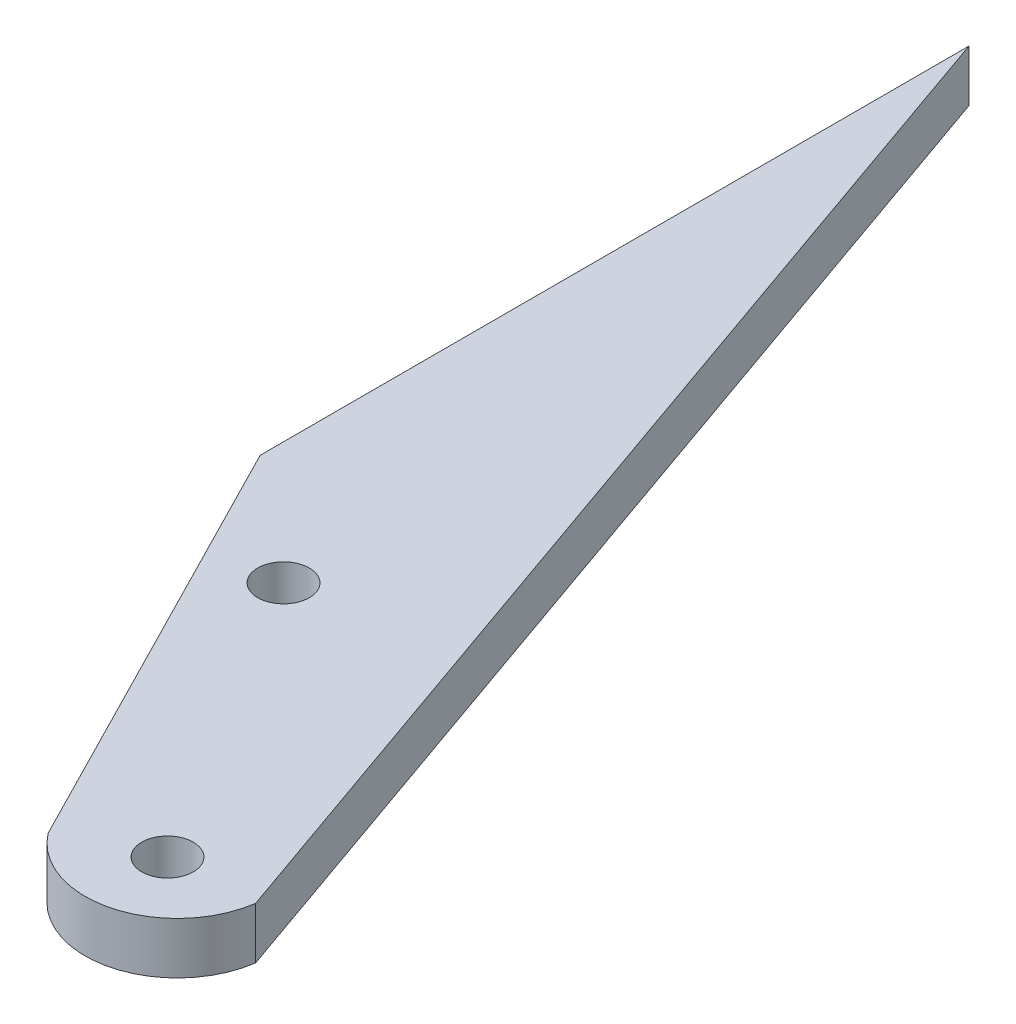
ISO-10303-21;
HEADER;
FILE_DESCRIPTION(('STEP AP214'),'2;1');
FILE_NAME('part.step','',(''),(''),'','','');
FILE_SCHEMA(('AUTOMOTIVE_DESIGN { 1 0 10303 214 1 1 1 1 }'));
ENDSEC;
DATA;
#1=APPLICATION_CONTEXT('core data for automotive mechanical design processes');
#2=APPLICATION_PROTOCOL_DEFINITION('international standard','automotive_design',2000,#1);
#3=PRODUCT_CONTEXT('',#1,'mechanical');
#4=PRODUCT('Part','Part','',(#3));
#5=PRODUCT_RELATED_PRODUCT_CATEGORY('part','',(#4));
#6=PRODUCT_DEFINITION_FORMATION('','',#4);
#7=PRODUCT_DEFINITION_CONTEXT('part definition',#1,'design');
#8=PRODUCT_DEFINITION('design','',#6,#7);
#9=PRODUCT_DEFINITION_SHAPE('','',#8);
#10=(LENGTH_UNIT() NAMED_UNIT(*) SI_UNIT(.MILLI.,.METRE.));
#11=(NAMED_UNIT(*) PLANE_ANGLE_UNIT() SI_UNIT($,.RADIAN.));
#12=(NAMED_UNIT(*) SI_UNIT($,.STERADIAN.) SOLID_ANGLE_UNIT());
#13=UNCERTAINTY_MEASURE_WITH_UNIT(LENGTH_MEASURE(1.E-05),#10,'distance_accuracy_value','');
#14=(GEOMETRIC_REPRESENTATION_CONTEXT(3) GLOBAL_UNCERTAINTY_ASSIGNED_CONTEXT((#13)) GLOBAL_UNIT_ASSIGNED_CONTEXT((#10,
#11,#12)) REPRESENTATION_CONTEXT('',''));
#15=CARTESIAN_POINT('',(0.,0.,0.));
#16=DIRECTION('',(0.,0.,1.));
#17=DIRECTION('',(1.,0.,0.));
#18=AXIS2_PLACEMENT_3D('',#15,#16,#17);
#19=CARTESIAN_POINT('',(-5.30816711174511,3.,-0.748327119110209));
#20=DIRECTION('',(0.,1.,0.));
#21=DIRECTION('',(0.,0.,1.));
#22=AXIS2_PLACEMENT_3D('',#19,#20,#21);
#23=PLANE('',#22);
#24=CARTESIAN_POINT('',(-15.3364804045532,3.,-16.9587094149926));
#25=DIRECTION('',(0.,1.,0.));
#26=DIRECTION('',(0.,0.,1.));
#27=AXIS2_PLACEMENT_3D('',#24,#25,#26);
#28=CIRCLE('',#27,1.5);
#29=CARTESIAN_POINT('',(-15.3364804045532,3.,-15.4587094149926));
#30=VERTEX_POINT('',#29);
#31=EDGE_CURVE('E117',#30,#30,#28,.T.);
#32=ORIENTED_EDGE('',*,*,#31,.F.);
#33=EDGE_LOOP('',(#32));
#34=FACE_BOUND('',#33,.T.);
#35=DIRECTION('',(-0.331173209478894,0.,-0.94356997902829));
#36=VECTOR('',#35,1.);
#37=CARTESIAN_POINT('',(-22.4436084063846,3.,-63.9457374787472));
#38=LINE('',#37,#36);
#39=CARTESIAN_POINT('',(0.,3.,0.));
#40=VERTEX_POINT('',#39);
#41=CARTESIAN_POINT('',(-22.4436084063846,3.,-63.9457374787472));
#42=VERTEX_POINT('',#41);
#43=EDGE_CURVE('E96',#40,#42,#38,.T.);
#44=ORIENTED_EDGE('',*,*,#43,.T.);
#45=DIRECTION('',(0.,0.,1.));
#46=VECTOR('',#45,1.);
#47=CARTESIAN_POINT('',(-22.4436084063846,3.,-63.9457374787472));
#48=LINE('',#47,#46);
#49=CARTESIAN_POINT('',(-22.4436084063846,3.,-22.7057374787472));
#50=VERTEX_POINT('',#49);
#51=EDGE_CURVE('E91',#42,#50,#48,.T.);
#52=ORIENTED_EDGE('',*,*,#51,.T.);
#53=DIRECTION('',(0.454767876649294,0.,0.890610003518876));
#54=VECTOR('',#53,1.);
#55=CARTESIAN_POINT('',(-22.4436084063846,3.,-22.7057374787472));
#56=LINE('',#55,#54);
#57=CARTESIAN_POINT('',(-9.57367749720963,3.,2.49852562083696));
#58=VERTEX_POINT('',#57);
#59=EDGE_CURVE('E94',#50,#58,#56,.T.);
#60=ORIENTED_EDGE('',*,*,#59,.T.);
#61=CARTESIAN_POINT('',(-5.30816711174511,3.,-0.748327119110209));
#62=DIRECTION('',(0.,1.,0.));
#63=DIRECTION('',(0.,0.,1.));
#64=AXIS2_PLACEMENT_3D('',#61,#62,#63);
#65=CIRCLE('',#64,5.36065588929267);
#66=EDGE_CURVE('E61',#58,#40,#65,.T.);
#67=ORIENTED_EDGE('',*,*,#66,.T.);
#68=EDGE_LOOP('',(#44,#52,#60,#67));
#69=FACE_BOUND('',#68,.T.);
#70=CARTESIAN_POINT('',(-4.89794958161071,3.,0.229925616867271));
#71=DIRECTION('',(0.,1.,0.));
#72=DIRECTION('',(0.,0.,1.));
#73=AXIS2_PLACEMENT_3D('',#70,#71,#72);
#74=CIRCLE('',#73,1.5);
#75=CARTESIAN_POINT('',(-4.89794958161071,3.,1.72992561686727));
#76=VERTEX_POINT('',#75);
#77=EDGE_CURVE('E141',#76,#76,#74,.T.);
#78=ORIENTED_EDGE('',*,*,#77,.F.);
#79=EDGE_LOOP('',(#78));
#80=FACE_BOUND('',#79,.T.);
#81=ADVANCED_FACE('F43',(#34,#69,#80),#23,.T.);
#82=CARTESIAN_POINT('',(-5.30816711174511,0.,-0.748327119110209));
#83=DIRECTION('',(0.,1.,0.));
#84=DIRECTION('',(0.,0.,1.));
#85=AXIS2_PLACEMENT_3D('',#82,#83,#84);
#86=PLANE('',#85);
#87=DIRECTION('',(-0.331173209478894,0.,-0.94356997902829));
#88=VECTOR('',#87,1.);
#89=CARTESIAN_POINT('',(-22.4436084063846,0.,-63.9457374787472));
#90=LINE('',#89,#88);
#91=CARTESIAN_POINT('',(0.,0.,0.));
#92=VERTEX_POINT('',#91);
#93=CARTESIAN_POINT('',(-22.4436084063846,0.,-63.9457374787472));
#94=VERTEX_POINT('',#93);
#95=EDGE_CURVE('E113',#92,#94,#90,.T.);
#96=ORIENTED_EDGE('',*,*,#95,.F.);
#97=CARTESIAN_POINT('',(-5.30816711174511,0.,-0.748327119110209));
#98=DIRECTION('',(0.,1.,0.));
#99=DIRECTION('',(0.,0.,1.));
#100=AXIS2_PLACEMENT_3D('',#97,#98,#99);
#101=CIRCLE('',#100,5.36065588929267);
#102=CARTESIAN_POINT('',(-9.57367749720963,0.,2.49852562083696));
#103=VERTEX_POINT('',#102);
#104=EDGE_CURVE('E84',#103,#92,#101,.T.);
#105=ORIENTED_EDGE('',*,*,#104,.F.);
#106=DIRECTION('',(0.454767876649294,0.,0.890610003518876));
#107=VECTOR('',#106,1.);
#108=CARTESIAN_POINT('',(-22.4436084063846,0.,-22.7057374787472));
#109=LINE('',#108,#107);
#110=CARTESIAN_POINT('',(-22.4436084063846,0.,-22.7057374787472));
#111=VERTEX_POINT('',#110);
#112=EDGE_CURVE('E78',#111,#103,#109,.T.);
#113=ORIENTED_EDGE('',*,*,#112,.F.);
#114=DIRECTION('',(0.,0.,1.));
#115=VECTOR('',#114,1.);
#116=CARTESIAN_POINT('',(-22.4436084063846,0.,-63.9457374787472));
#117=LINE('',#116,#115);
#118=EDGE_CURVE('E101',#94,#111,#117,.T.);
#119=ORIENTED_EDGE('',*,*,#118,.F.);
#120=EDGE_LOOP('',(#96,#105,#113,#119));
#121=FACE_BOUND('',#120,.T.);
#122=CARTESIAN_POINT('',(-15.3364804045532,0.,-16.9587094149926));
#123=DIRECTION('',(0.,1.,0.));
#124=DIRECTION('',(0.,0.,1.));
#125=AXIS2_PLACEMENT_3D('',#122,#123,#124);
#126=CIRCLE('',#125,1.5);
#127=CARTESIAN_POINT('',(-15.3364804045532,0.,-15.4587094149926));
#128=VERTEX_POINT('',#127);
#129=EDGE_CURVE('E137',#128,#128,#126,.T.);
#130=ORIENTED_EDGE('',*,*,#129,.T.);
#131=EDGE_LOOP('',(#130));
#132=FACE_BOUND('',#131,.T.);
#133=CARTESIAN_POINT('',(-4.89794958161071,0.,0.229925616867271));
#134=DIRECTION('',(0.,1.,0.));
#135=DIRECTION('',(0.,0.,1.));
#136=AXIS2_PLACEMENT_3D('',#133,#134,#135);
#137=CIRCLE('',#136,1.5);
#138=CARTESIAN_POINT('',(-4.89794958161071,0.,1.72992561686727));
#139=VERTEX_POINT('',#138);
#140=EDGE_CURVE('E145',#139,#139,#137,.T.);
#141=ORIENTED_EDGE('',*,*,#140,.T.);
#142=EDGE_LOOP('',(#141));
#143=FACE_BOUND('',#142,.T.);
#144=ADVANCED_FACE('F131',(#121,#132,#143),#86,.F.);
#145=CARTESIAN_POINT('',(-22.4436084063846,3.,-63.9457374787472));
#146=DIRECTION('',(-0.943569979028291,0.,0.331173209478894));
#147=DIRECTION('',(0.331173209478894,0.,0.943569979028291));
#148=AXIS2_PLACEMENT_3D('',#145,#146,#147);
#149=PLANE('',#148);
#150=ORIENTED_EDGE('',*,*,#95,.T.);
#151=DIRECTION('',(0.,-1.,0.));
#152=VECTOR('',#151,1.);
#153=CARTESIAN_POINT('',(-22.4436084063846,3.,-63.9457374787472));
#154=LINE('',#153,#152);
#155=EDGE_CURVE('E11',#42,#94,#154,.T.);
#156=ORIENTED_EDGE('',*,*,#155,.F.);
#157=ORIENTED_EDGE('',*,*,#43,.F.);
#158=DIRECTION('',(0.,-1.,0.));
#159=VECTOR('',#158,1.);
#160=CARTESIAN_POINT('',(0.,3.,0.));
#161=LINE('',#160,#159);
#162=EDGE_CURVE('E109',#40,#92,#161,.T.);
#163=ORIENTED_EDGE('',*,*,#162,.T.);
#164=EDGE_LOOP('',(#150,#156,#157,#163));
#165=FACE_BOUND('',#164,.T.);
#166=ADVANCED_FACE('F45',(#165),#149,.F.);
#167=CARTESIAN_POINT('',(-22.4436084063846,3.,-63.9457374787472));
#168=DIRECTION('',(1.,0.,0.));
#169=DIRECTION('',(0.,0.,-1.));
#170=AXIS2_PLACEMENT_3D('',#167,#168,#169);
#171=PLANE('',#170);
#172=ORIENTED_EDGE('',*,*,#118,.T.);
#173=DIRECTION('',(0.,-1.,0.));
#174=VECTOR('',#173,1.);
#175=CARTESIAN_POINT('',(-22.4436084063846,3.,-22.7057374787472));
#176=LINE('',#175,#174);
#177=EDGE_CURVE('E53',#50,#111,#176,.T.);
#178=ORIENTED_EDGE('',*,*,#177,.F.);
#179=ORIENTED_EDGE('',*,*,#51,.F.);
#180=ORIENTED_EDGE('',*,*,#155,.T.);
#181=EDGE_LOOP('',(#172,#178,#179,#180));
#182=FACE_BOUND('',#181,.T.);
#183=ADVANCED_FACE('F100',(#182),#171,.F.);
#184=CARTESIAN_POINT('',(-22.4436084063846,3.,-22.7057374787472));
#185=DIRECTION('',(0.890610003518876,0.,-0.454767876649294));
#186=DIRECTION('',(-0.454767876649294,0.,-0.890610003518876));
#187=AXIS2_PLACEMENT_3D('',#184,#185,#186);
#188=PLANE('',#187);
#189=ORIENTED_EDGE('',*,*,#112,.T.);
#190=DIRECTION('',(0.,-1.,0.));
#191=VECTOR('',#190,1.);
#192=CARTESIAN_POINT('',(-9.57367749720963,3.,2.49852562083696));
#193=LINE('',#192,#191);
#194=EDGE_CURVE('E103',#58,#103,#193,.T.);
#195=ORIENTED_EDGE('',*,*,#194,.F.);
#196=ORIENTED_EDGE('',*,*,#59,.F.);
#197=ORIENTED_EDGE('',*,*,#177,.T.);
#198=EDGE_LOOP('',(#189,#195,#196,#197));
#199=FACE_BOUND('',#198,.T.);
#200=ADVANCED_FACE('F104',(#199),#188,.F.);
#201=CARTESIAN_POINT('',(-5.30816711174511,3.,-0.748327119110209));
#202=DIRECTION('',(0.,-1.,0.));
#203=DIRECTION('',(0.,0.,-1.));
#204=AXIS2_PLACEMENT_3D('',#201,#202,#203);
#205=CYLINDRICAL_SURFACE('',#204,5.36065588929267);
#206=ORIENTED_EDGE('',*,*,#104,.T.);
#207=ORIENTED_EDGE('',*,*,#162,.F.);
#208=ORIENTED_EDGE('',*,*,#66,.F.);
#209=ORIENTED_EDGE('',*,*,#194,.T.);
#210=EDGE_LOOP('',(#206,#207,#208,#209));
#211=FACE_BOUND('',#210,.T.);
#212=ADVANCED_FACE('F128',(#211),#205,.T.);
#213=CARTESIAN_POINT('',(-15.3364804045532,3.,-16.9587094149926));
#214=DIRECTION('',(0.,-1.,0.));
#215=DIRECTION('',(0.,0.,-1.));
#216=AXIS2_PLACEMENT_3D('',#213,#214,#215);
#217=CYLINDRICAL_SURFACE('',#216,1.5);
#218=ORIENTED_EDGE('',*,*,#31,.T.);
#219=EDGE_LOOP('',(#218));
#220=FACE_BOUND('',#219,.T.);
#221=ORIENTED_EDGE('',*,*,#129,.F.);
#222=EDGE_LOOP('',(#221));
#223=FACE_BOUND('',#222,.T.);
#224=ADVANCED_FACE('F165',(#220,#223),#217,.F.);
#225=CARTESIAN_POINT('',(-4.89794958161071,3.,0.229925616867271));
#226=DIRECTION('',(0.,-1.,0.));
#227=DIRECTION('',(0.,0.,-1.));
#228=AXIS2_PLACEMENT_3D('',#225,#226,#227);
#229=CYLINDRICAL_SURFACE('',#228,1.5);
#230=ORIENTED_EDGE('',*,*,#77,.T.);
#231=EDGE_LOOP('',(#230));
#232=FACE_BOUND('',#231,.T.);
#233=ORIENTED_EDGE('',*,*,#140,.F.);
#234=EDGE_LOOP('',(#233));
#235=FACE_BOUND('',#234,.T.);
#236=ADVANCED_FACE('F154',(#232,#235),#229,.F.);
#237=CLOSED_SHELL('',(#81,#144,#166,#183,#200,#212,#224,#236));
#238=MANIFOLD_SOLID_BREP('B2',#237);
#239=ADVANCED_BREP_SHAPE_REPRESENTATION('',(#18,#238),#14);
#240=SHAPE_DEFINITION_REPRESENTATION(#9,#239);
ENDSEC;
END-ISO-10303-21;
